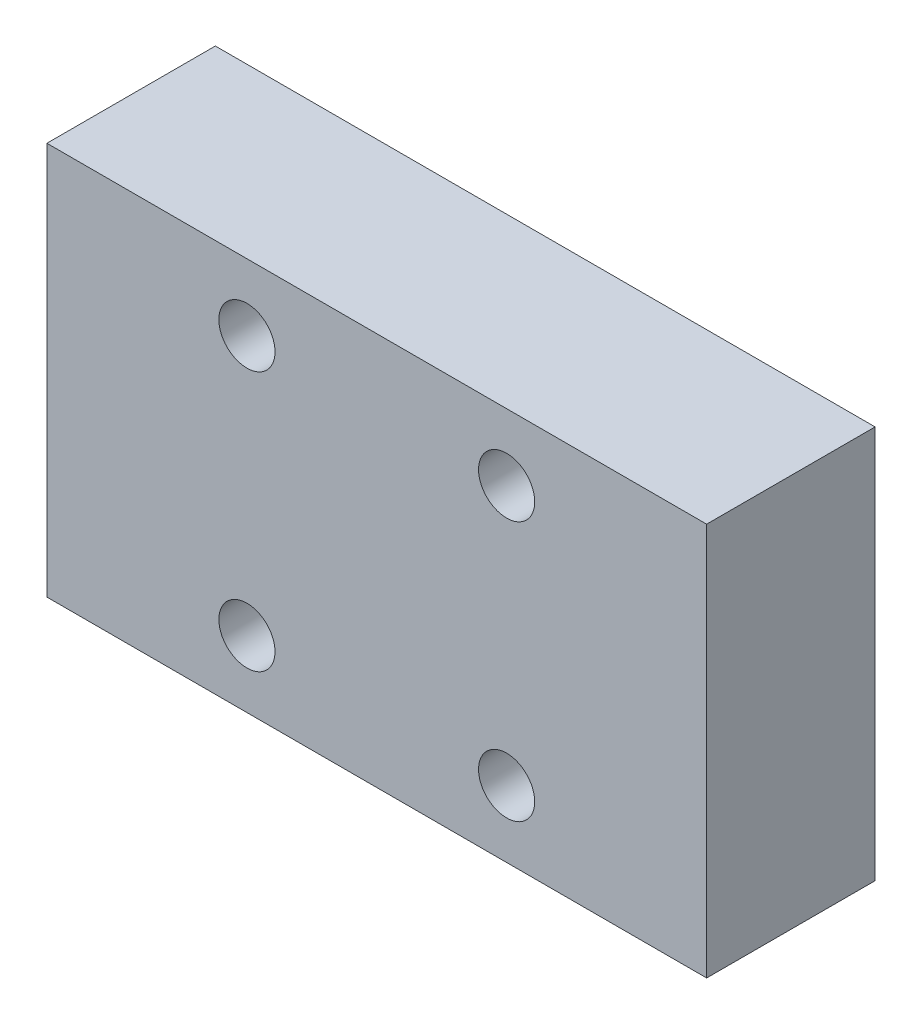
ISO-10303-21;
HEADER;
FILE_DESCRIPTION(('STEP AP214'),'2;1');
FILE_NAME('part.step','',(''),(''),'','','');
FILE_SCHEMA(('AUTOMOTIVE_DESIGN { 1 0 10303 214 1 1 1 1 }'));
ENDSEC;
DATA;
#1=APPLICATION_CONTEXT('core data for automotive mechanical design processes');
#2=APPLICATION_PROTOCOL_DEFINITION('international standard','automotive_design',2000,#1);
#3=PRODUCT_CONTEXT('',#1,'mechanical');
#4=PRODUCT('Part','Part','',(#3));
#5=PRODUCT_RELATED_PRODUCT_CATEGORY('part','',(#4));
#6=PRODUCT_DEFINITION_FORMATION('','',#4);
#7=PRODUCT_DEFINITION_CONTEXT('part definition',#1,'design');
#8=PRODUCT_DEFINITION('design','',#6,#7);
#9=PRODUCT_DEFINITION_SHAPE('','',#8);
#10=(LENGTH_UNIT() NAMED_UNIT(*) SI_UNIT(.MILLI.,.METRE.));
#11=(NAMED_UNIT(*) PLANE_ANGLE_UNIT() SI_UNIT($,.RADIAN.));
#12=(NAMED_UNIT(*) SI_UNIT($,.STERADIAN.) SOLID_ANGLE_UNIT());
#13=UNCERTAINTY_MEASURE_WITH_UNIT(LENGTH_MEASURE(1.E-05),#10,'distance_accuracy_value','');
#14=(GEOMETRIC_REPRESENTATION_CONTEXT(3) GLOBAL_UNCERTAINTY_ASSIGNED_CONTEXT((#13)) GLOBAL_UNIT_ASSIGNED_CONTEXT((#10,
#11,#12)) REPRESENTATION_CONTEXT('',''));
#15=CARTESIAN_POINT('',(0.,0.,0.));
#16=DIRECTION('',(0.,0.,1.));
#17=DIRECTION('',(1.,0.,0.));
#18=AXIS2_PLACEMENT_3D('',#15,#16,#17);
#19=CARTESIAN_POINT('',(-33.9416058394161,36.5693430656934,12.));
#20=DIRECTION('',(1.,0.,0.));
#21=DIRECTION('',(0.,1.,0.));
#22=AXIS2_PLACEMENT_3D('',#19,#20,#21);
#23=PLANE('',#22);
#24=DIRECTION('',(0.,-1.,0.));
#25=VECTOR('',#24,1.);
#26=CARTESIAN_POINT('',(-33.9416058394161,36.5693430656934,0.));
#27=LINE('',#26,#25);
#28=CARTESIAN_POINT('',(-33.9416058394161,36.5693430656934,0.));
#29=VERTEX_POINT('',#28);
#30=CARTESIAN_POINT('',(-33.9416058394161,8.56934306569345,0.));
#31=VERTEX_POINT('',#30);
#32=EDGE_CURVE('E97',#29,#31,#27,.T.);
#33=ORIENTED_EDGE('',*,*,#32,.T.);
#34=DIRECTION('',(0.,0.,-1.));
#35=VECTOR('',#34,1.);
#36=CARTESIAN_POINT('',(-33.9416058394161,8.56934306569345,12.));
#37=LINE('',#36,#35);
#38=CARTESIAN_POINT('',(-33.9416058394161,8.56934306569345,12.));
#39=VERTEX_POINT('',#38);
#40=EDGE_CURVE('E11',#39,#31,#37,.T.);
#41=ORIENTED_EDGE('',*,*,#40,.F.);
#42=DIRECTION('',(0.,-1.,0.));
#43=VECTOR('',#42,1.);
#44=CARTESIAN_POINT('',(-33.9416058394161,36.5693430656934,12.));
#45=LINE('',#44,#43);
#46=CARTESIAN_POINT('',(-33.9416058394161,36.5693430656934,12.));
#47=VERTEX_POINT('',#46);
#48=EDGE_CURVE('E83',#47,#39,#45,.T.);
#49=ORIENTED_EDGE('',*,*,#48,.F.);
#50=DIRECTION('',(0.,0.,-1.));
#51=VECTOR('',#50,1.);
#52=CARTESIAN_POINT('',(-33.9416058394161,36.5693430656934,12.));
#53=LINE('',#52,#51);
#54=EDGE_CURVE('E50',#47,#29,#53,.T.);
#55=ORIENTED_EDGE('',*,*,#54,.T.);
#56=EDGE_LOOP('',(#33,#41,#49,#55));
#57=FACE_BOUND('',#56,.T.);
#58=ADVANCED_FACE('F34',(#57),#23,.F.);
#59=CARTESIAN_POINT('',(-33.9416058394161,8.56934306569345,12.));
#60=DIRECTION('',(0.,1.,0.));
#61=DIRECTION('',(0.,0.,1.));
#62=AXIS2_PLACEMENT_3D('',#59,#60,#61);
#63=PLANE('',#62);
#64=DIRECTION('',(1.,0.,0.));
#65=VECTOR('',#64,1.);
#66=CARTESIAN_POINT('',(-33.9416058394161,8.56934306569345,0.));
#67=LINE('',#66,#65);
#68=CARTESIAN_POINT('',(13.0583941605839,8.56934306569345,0.));
#69=VERTEX_POINT('',#68);
#70=EDGE_CURVE('E88',#31,#69,#67,.T.);
#71=ORIENTED_EDGE('',*,*,#70,.T.);
#72=DIRECTION('',(0.,0.,-1.));
#73=VECTOR('',#72,1.);
#74=CARTESIAN_POINT('',(13.0583941605839,8.56934306569345,12.));
#75=LINE('',#74,#73);
#76=CARTESIAN_POINT('',(13.0583941605839,8.56934306569345,12.));
#77=VERTEX_POINT('',#76);
#78=EDGE_CURVE('E42',#77,#69,#75,.T.);
#79=ORIENTED_EDGE('',*,*,#78,.F.);
#80=DIRECTION('',(1.,0.,0.));
#81=VECTOR('',#80,1.);
#82=CARTESIAN_POINT('',(-33.9416058394161,8.56934306569345,12.));
#83=LINE('',#82,#81);
#84=EDGE_CURVE('E75',#39,#77,#83,.T.);
#85=ORIENTED_EDGE('',*,*,#84,.F.);
#86=ORIENTED_EDGE('',*,*,#40,.T.);
#87=EDGE_LOOP('',(#71,#79,#85,#86));
#88=FACE_BOUND('',#87,.T.);
#89=ADVANCED_FACE('F87',(#88),#63,.F.);
#90=CARTESIAN_POINT('',(13.0583941605839,36.5693430656934,12.));
#91=DIRECTION('',(1.,0.,0.));
#92=DIRECTION('',(0.,0.,-1.));
#93=AXIS2_PLACEMENT_3D('',#90,#91,#92);
#94=PLANE('',#93);
#95=DIRECTION('',(0.,-1.,0.));
#96=VECTOR('',#95,1.);
#97=CARTESIAN_POINT('',(13.0583941605839,36.5693430656934,0.));
#98=LINE('',#97,#96);
#99=CARTESIAN_POINT('',(13.0583941605839,36.5693430656934,0.));
#100=VERTEX_POINT('',#99);
#101=EDGE_CURVE('E101',#100,#69,#98,.T.);
#102=ORIENTED_EDGE('',*,*,#101,.F.);
#103=DIRECTION('',(0.,0.,-1.));
#104=VECTOR('',#103,1.);
#105=CARTESIAN_POINT('',(13.0583941605839,36.5693430656934,12.));
#106=LINE('',#105,#104);
#107=CARTESIAN_POINT('',(13.0583941605839,36.5693430656934,12.));
#108=VERTEX_POINT('',#107);
#109=EDGE_CURVE('E64',#108,#100,#106,.T.);
#110=ORIENTED_EDGE('',*,*,#109,.F.);
#111=DIRECTION('',(0.,-1.,0.));
#112=VECTOR('',#111,1.);
#113=CARTESIAN_POINT('',(13.0583941605839,36.5693430656934,12.));
#114=LINE('',#113,#112);
#115=EDGE_CURVE('E82',#108,#77,#114,.T.);
#116=ORIENTED_EDGE('',*,*,#115,.T.);
#117=ORIENTED_EDGE('',*,*,#78,.T.);
#118=EDGE_LOOP('',(#102,#110,#116,#117));
#119=FACE_BOUND('',#118,.T.);
#120=ADVANCED_FACE('F91',(#119),#94,.T.);
#121=CARTESIAN_POINT('',(-33.9416058394161,36.5693430656934,12.));
#122=DIRECTION('',(0.,1.,0.));
#123=DIRECTION('',(0.,0.,1.));
#124=AXIS2_PLACEMENT_3D('',#121,#122,#123);
#125=PLANE('',#124);
#126=DIRECTION('',(1.,0.,0.));
#127=VECTOR('',#126,1.);
#128=CARTESIAN_POINT('',(-33.9416058394161,36.5693430656934,0.));
#129=LINE('',#128,#127);
#130=EDGE_CURVE('E103',#29,#100,#129,.T.);
#131=ORIENTED_EDGE('',*,*,#130,.F.);
#132=ORIENTED_EDGE('',*,*,#54,.F.);
#133=DIRECTION('',(1.,0.,0.));
#134=VECTOR('',#133,1.);
#135=CARTESIAN_POINT('',(-33.9416058394161,36.5693430656934,12.));
#136=LINE('',#135,#134);
#137=EDGE_CURVE('E92',#47,#108,#136,.T.);
#138=ORIENTED_EDGE('',*,*,#137,.T.);
#139=ORIENTED_EDGE('',*,*,#109,.T.);
#140=EDGE_LOOP('',(#131,#132,#138,#139));
#141=FACE_BOUND('',#140,.T.);
#142=ADVANCED_FACE('F145',(#141),#125,.T.);
#143=CARTESIAN_POINT('',(0.,0.,12.));
#144=DIRECTION('',(0.,0.,1.));
#145=DIRECTION('',(1.,0.,0.));
#146=AXIS2_PLACEMENT_3D('',#143,#144,#145);
#147=PLANE('',#146);
#148=CARTESIAN_POINT('',(-19.6916058394161,13.3193430656935,12.));
#149=DIRECTION('',(0.,0.,1.));
#150=DIRECTION('',(-1.,0.,0.));
#151=AXIS2_PLACEMENT_3D('',#148,#149,#150);
#152=CIRCLE('',#151,2.);
#153=CARTESIAN_POINT('',(-21.6916058394161,13.3193430656935,12.));
#154=VERTEX_POINT('',#153);
#155=EDGE_CURVE('E127',#154,#154,#152,.T.);
#156=ORIENTED_EDGE('',*,*,#155,.F.);
#157=EDGE_LOOP('',(#156));
#158=FACE_BOUND('',#157,.T.);
#159=CARTESIAN_POINT('',(-1.19160583941608,13.3193430656935,12.));
#160=DIRECTION('',(0.,0.,1.));
#161=DIRECTION('',(1.,0.,0.));
#162=AXIS2_PLACEMENT_3D('',#159,#160,#161);
#163=CIRCLE('',#162,2.);
#164=CARTESIAN_POINT('',(0.808394160583928,13.3193430656935,12.));
#165=VERTEX_POINT('',#164);
#166=EDGE_CURVE('E121',#165,#165,#163,.T.);
#167=ORIENTED_EDGE('',*,*,#166,.F.);
#168=EDGE_LOOP('',(#167));
#169=FACE_BOUND('',#168,.T.);
#170=CARTESIAN_POINT('',(-1.19160583941608,31.8193430656935,12.));
#171=DIRECTION('',(0.,0.,1.));
#172=DIRECTION('',(-1.,0.,0.));
#173=AXIS2_PLACEMENT_3D('',#170,#171,#172);
#174=CIRCLE('',#173,2.00000000000001);
#175=CARTESIAN_POINT('',(-3.19160583941608,31.8193430656935,12.));
#176=VERTEX_POINT('',#175);
#177=EDGE_CURVE('E115',#176,#176,#174,.T.);
#178=ORIENTED_EDGE('',*,*,#177,.F.);
#179=EDGE_LOOP('',(#178));
#180=FACE_BOUND('',#179,.T.);
#181=CARTESIAN_POINT('',(-19.6916058394161,31.8193430656935,12.));
#182=DIRECTION('',(0.,0.,1.));
#183=DIRECTION('',(1.,0.,0.));
#184=AXIS2_PLACEMENT_3D('',#181,#182,#183);
#185=CIRCLE('',#184,2.00000000000001);
#186=CARTESIAN_POINT('',(-17.6916058394161,31.8193430656935,12.));
#187=VERTEX_POINT('',#186);
#188=EDGE_CURVE('E109',#187,#187,#185,.T.);
#189=ORIENTED_EDGE('',*,*,#188,.F.);
#190=EDGE_LOOP('',(#189));
#191=FACE_BOUND('',#190,.T.);
#192=ORIENTED_EDGE('',*,*,#48,.T.);
#193=ORIENTED_EDGE('',*,*,#84,.T.);
#194=ORIENTED_EDGE('',*,*,#115,.F.);
#195=ORIENTED_EDGE('',*,*,#137,.F.);
#196=EDGE_LOOP('',(#192,#193,#194,#195));
#197=FACE_BOUND('',#196,.T.);
#198=ADVANCED_FACE('F79',(#158,#169,#180,#191,#197),#147,.T.);
#199=CARTESIAN_POINT('',(0.,0.,0.));
#200=DIRECTION('',(0.,0.,1.));
#201=DIRECTION('',(1.,0.,0.));
#202=AXIS2_PLACEMENT_3D('',#199,#200,#201);
#203=PLANE('',#202);
#204=CARTESIAN_POINT('',(-19.6916058394161,13.3193430656935,0.));
#205=DIRECTION('',(0.,0.,1.));
#206=DIRECTION('',(-1.,0.,0.));
#207=AXIS2_PLACEMENT_3D('',#204,#205,#206);
#208=CIRCLE('',#207,2.);
#209=CARTESIAN_POINT('',(-21.6916058394161,13.3193430656935,0.));
#210=VERTEX_POINT('',#209);
#211=EDGE_CURVE('E124',#210,#210,#208,.T.);
#212=ORIENTED_EDGE('',*,*,#211,.T.);
#213=EDGE_LOOP('',(#212));
#214=FACE_BOUND('',#213,.T.);
#215=CARTESIAN_POINT('',(-1.19160583941608,13.3193430656935,0.));
#216=DIRECTION('',(0.,0.,1.));
#217=DIRECTION('',(1.,0.,0.));
#218=AXIS2_PLACEMENT_3D('',#215,#216,#217);
#219=CIRCLE('',#218,2.);
#220=CARTESIAN_POINT('',(0.808394160583928,13.3193430656935,0.));
#221=VERTEX_POINT('',#220);
#222=EDGE_CURVE('E118',#221,#221,#219,.T.);
#223=ORIENTED_EDGE('',*,*,#222,.T.);
#224=EDGE_LOOP('',(#223));
#225=FACE_BOUND('',#224,.T.);
#226=CARTESIAN_POINT('',(-1.19160583941608,31.8193430656935,0.));
#227=DIRECTION('',(0.,0.,1.));
#228=DIRECTION('',(-1.,0.,0.));
#229=AXIS2_PLACEMENT_3D('',#226,#227,#228);
#230=CIRCLE('',#229,2.00000000000001);
#231=CARTESIAN_POINT('',(-3.19160583941608,31.8193430656935,0.));
#232=VERTEX_POINT('',#231);
#233=EDGE_CURVE('E112',#232,#232,#230,.T.);
#234=ORIENTED_EDGE('',*,*,#233,.T.);
#235=EDGE_LOOP('',(#234));
#236=FACE_BOUND('',#235,.T.);
#237=CARTESIAN_POINT('',(-19.6916058394161,31.8193430656935,0.));
#238=DIRECTION('',(0.,0.,1.));
#239=DIRECTION('',(1.,0.,0.));
#240=AXIS2_PLACEMENT_3D('',#237,#238,#239);
#241=CIRCLE('',#240,2.00000000000001);
#242=CARTESIAN_POINT('',(-17.6916058394161,31.8193430656935,0.));
#243=VERTEX_POINT('',#242);
#244=EDGE_CURVE('E99',#243,#243,#241,.T.);
#245=ORIENTED_EDGE('',*,*,#244,.T.);
#246=EDGE_LOOP('',(#245));
#247=FACE_BOUND('',#246,.T.);
#248=ORIENTED_EDGE('',*,*,#32,.F.);
#249=ORIENTED_EDGE('',*,*,#130,.T.);
#250=ORIENTED_EDGE('',*,*,#101,.T.);
#251=ORIENTED_EDGE('',*,*,#70,.F.);
#252=EDGE_LOOP('',(#248,#249,#250,#251));
#253=FACE_BOUND('',#252,.T.);
#254=ADVANCED_FACE('F133',(#214,#225,#236,#247,#253),#203,.F.);
#255=CARTESIAN_POINT('',(-19.6916058394161,31.8193430656935,0.));
#256=DIRECTION('',(0.,0.,1.));
#257=DIRECTION('',(1.,0.,0.));
#258=AXIS2_PLACEMENT_3D('',#255,#256,#257);
#259=CYLINDRICAL_SURFACE('',#258,2.00000000000001);
#260=ORIENTED_EDGE('',*,*,#244,.F.);
#261=EDGE_LOOP('',(#260));
#262=FACE_BOUND('',#261,.T.);
#263=ORIENTED_EDGE('',*,*,#188,.T.);
#264=EDGE_LOOP('',(#263));
#265=FACE_BOUND('',#264,.T.);
#266=ADVANCED_FACE('F153',(#262,#265),#259,.F.);
#267=CARTESIAN_POINT('',(-1.19160583941608,31.8193430656935,0.));
#268=DIRECTION('',(0.,0.,1.));
#269=DIRECTION('',(1.,0.,0.));
#270=AXIS2_PLACEMENT_3D('',#267,#268,#269);
#271=CYLINDRICAL_SURFACE('',#270,2.00000000000001);
#272=ORIENTED_EDGE('',*,*,#233,.F.);
#273=EDGE_LOOP('',(#272));
#274=FACE_BOUND('',#273,.T.);
#275=ORIENTED_EDGE('',*,*,#177,.T.);
#276=EDGE_LOOP('',(#275));
#277=FACE_BOUND('',#276,.T.);
#278=ADVANCED_FACE('F155',(#274,#277),#271,.F.);
#279=CARTESIAN_POINT('',(-1.19160583941608,13.3193430656935,0.));
#280=DIRECTION('',(0.,0.,1.));
#281=DIRECTION('',(1.,0.,0.));
#282=AXIS2_PLACEMENT_3D('',#279,#280,#281);
#283=CYLINDRICAL_SURFACE('',#282,2.);
#284=ORIENTED_EDGE('',*,*,#222,.F.);
#285=EDGE_LOOP('',(#284));
#286=FACE_BOUND('',#285,.T.);
#287=ORIENTED_EDGE('',*,*,#166,.T.);
#288=EDGE_LOOP('',(#287));
#289=FACE_BOUND('',#288,.T.);
#290=ADVANCED_FACE('F139',(#286,#289),#283,.F.);
#291=CARTESIAN_POINT('',(-19.6916058394161,13.3193430656935,0.));
#292=DIRECTION('',(0.,0.,1.));
#293=DIRECTION('',(1.,0.,0.));
#294=AXIS2_PLACEMENT_3D('',#291,#292,#293);
#295=CYLINDRICAL_SURFACE('',#294,2.);
#296=ORIENTED_EDGE('',*,*,#211,.F.);
#297=EDGE_LOOP('',(#296));
#298=FACE_BOUND('',#297,.T.);
#299=ORIENTED_EDGE('',*,*,#155,.T.);
#300=EDGE_LOOP('',(#299));
#301=FACE_BOUND('',#300,.T.);
#302=ADVANCED_FACE('F136',(#298,#301),#295,.F.);
#303=CLOSED_SHELL('',(#58,#89,#120,#142,#198,#254,#266,#278,#290,#302));
#304=MANIFOLD_SOLID_BREP('B2',#303);
#305=ADVANCED_BREP_SHAPE_REPRESENTATION('',(#18,#304),#14);
#306=SHAPE_DEFINITION_REPRESENTATION(#9,#305);
ENDSEC;
END-ISO-10303-21;
